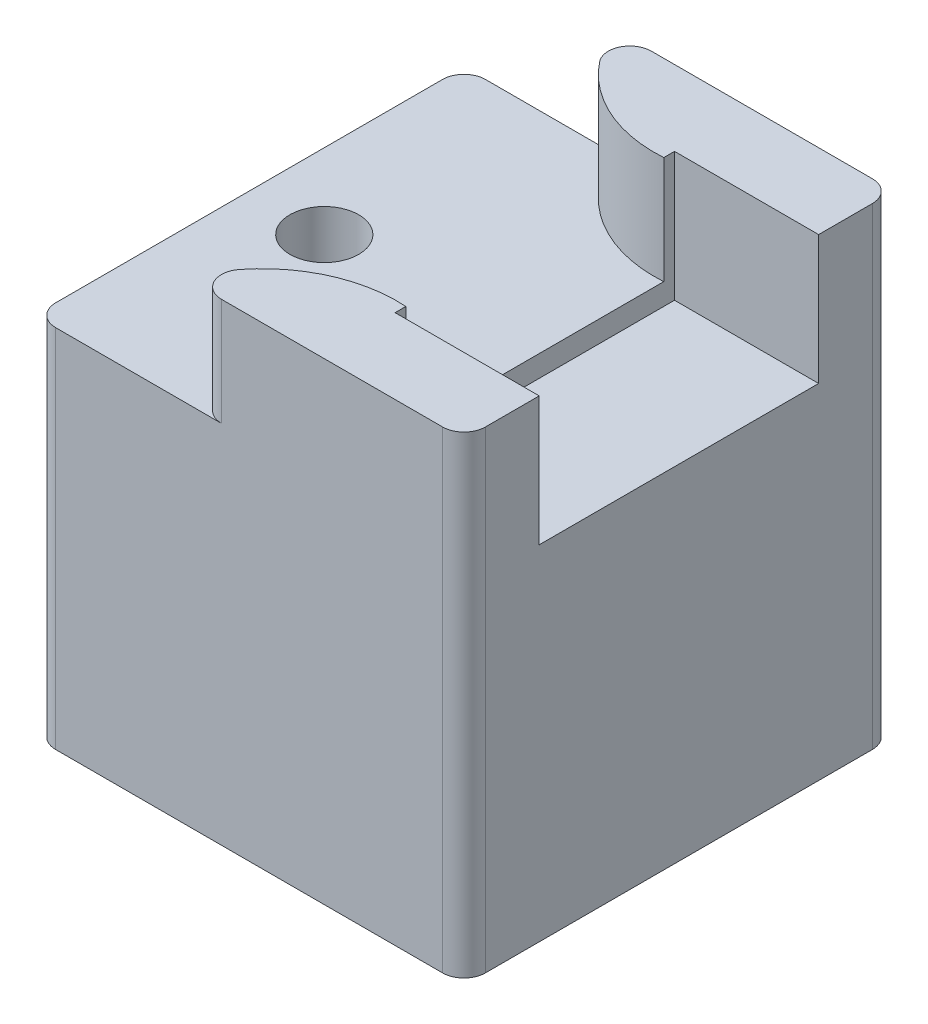
ISO-10303-21;
HEADER;
FILE_DESCRIPTION(('STEP AP214'),'2;1');
FILE_NAME('part.step','',(''),(''),'','','');
FILE_SCHEMA(('AUTOMOTIVE_DESIGN { 1 0 10303 214 1 1 1 1 }'));
ENDSEC;
DATA;
#1=APPLICATION_CONTEXT('core data for automotive mechanical design processes');
#2=APPLICATION_PROTOCOL_DEFINITION('international standard','automotive_design',2000,#1);
#3=PRODUCT_CONTEXT('',#1,'mechanical');
#4=PRODUCT('Part','Part','',(#3));
#5=PRODUCT_RELATED_PRODUCT_CATEGORY('part','',(#4));
#6=PRODUCT_DEFINITION_FORMATION('','',#4);
#7=PRODUCT_DEFINITION_CONTEXT('part definition',#1,'design');
#8=PRODUCT_DEFINITION('design','',#6,#7);
#9=PRODUCT_DEFINITION_SHAPE('','',#8);
#10=(LENGTH_UNIT() NAMED_UNIT(*) SI_UNIT(.MILLI.,.METRE.));
#11=(NAMED_UNIT(*) PLANE_ANGLE_UNIT() SI_UNIT($,.RADIAN.));
#12=(NAMED_UNIT(*) SI_UNIT($,.STERADIAN.) SOLID_ANGLE_UNIT());
#13=UNCERTAINTY_MEASURE_WITH_UNIT(LENGTH_MEASURE(1.E-05),#10,'distance_accuracy_value','');
#14=(GEOMETRIC_REPRESENTATION_CONTEXT(3) GLOBAL_UNCERTAINTY_ASSIGNED_CONTEXT((#13)) GLOBAL_UNIT_ASSIGNED_CONTEXT((#10,
#11,#12)) REPRESENTATION_CONTEXT('',''));
#15=CARTESIAN_POINT('',(0.,0.,0.));
#16=DIRECTION('',(0.,0.,1.));
#17=DIRECTION('',(1.,0.,0.));
#18=AXIS2_PLACEMENT_3D('',#15,#16,#17);
#19=CARTESIAN_POINT('',(-10.8433734939759,8.,-8.47389558232932));
#20=DIRECTION('',(1.,0.,0.));
#21=DIRECTION('',(0.,0.,-1.));
#22=AXIS2_PLACEMENT_3D('',#19,#20,#21);
#23=PLANE('',#22);
#24=DIRECTION('',(0.,0.,1.));
#25=VECTOR('',#24,1.);
#26=CARTESIAN_POINT('',(-10.8433734939759,3.,0.));
#27=LINE('',#26,#25);
#28=CARTESIAN_POINT('',(-10.8433734939759,3.,-7.47389558232932));
#29=VERTEX_POINT('',#28);
#30=CARTESIAN_POINT('',(-10.8433734939759,3.,10.5261044176707));
#31=VERTEX_POINT('',#30);
#32=EDGE_CURVE('E216',#29,#31,#27,.T.);
#33=ORIENTED_EDGE('',*,*,#32,.F.);
#34=DIRECTION('',(0.,-1.,0.));
#35=VECTOR('',#34,1.);
#36=CARTESIAN_POINT('',(-10.8433734939759,8.,-7.47389558232932));
#37=LINE('',#36,#35);
#38=CARTESIAN_POINT('',(-10.8433734939759,-14.,-7.47389558232932));
#39=VERTEX_POINT('',#38);
#40=EDGE_CURVE('E298',#29,#39,#37,.T.);
#41=ORIENTED_EDGE('',*,*,#40,.T.);
#42=DIRECTION('',(0.,0.,-1.));
#43=VECTOR('',#42,1.);
#44=CARTESIAN_POINT('',(-10.8433734939759,-14.,10.5261044176707));
#45=LINE('',#44,#43);
#46=CARTESIAN_POINT('',(-10.8433734939759,-14.,10.5261044176707));
#47=VERTEX_POINT('',#46);
#48=EDGE_CURVE('E181',#47,#39,#45,.T.);
#49=ORIENTED_EDGE('',*,*,#48,.F.);
#50=DIRECTION('',(0.,-1.,0.));
#51=VECTOR('',#50,1.);
#52=CARTESIAN_POINT('',(-10.8433734939759,8.,10.5261044176707));
#53=LINE('',#52,#51);
#54=EDGE_CURVE('E48',#47,#31,#53,.F.);
#55=ORIENTED_EDGE('',*,*,#54,.T.);
#56=EDGE_LOOP('',(#33,#41,#49,#55));
#57=FACE_BOUND('',#56,.T.);
#58=ADVANCED_FACE('F33',(#57),#23,.F.);
#59=CARTESIAN_POINT('',(-10.8433734939759,8.,11.5261044176707));
#60=DIRECTION('',(0.,0.,-1.));
#61=DIRECTION('',(-1.,0.,0.));
#62=AXIS2_PLACEMENT_3D('',#59,#60,#61);
#63=PLANE('',#62);
#64=DIRECTION('',(1.,0.,0.));
#65=VECTOR('',#64,1.);
#66=CARTESIAN_POINT('',(-10.8433734939759,8.,11.5261044176707));
#67=LINE('',#66,#65);
#68=CARTESIAN_POINT('',(-2.1258573550839,8.,11.5261044176707));
#69=VERTEX_POINT('',#68);
#70=CARTESIAN_POINT('',(8.1566265060241,8.,11.5261044176707));
#71=VERTEX_POINT('',#70);
#72=EDGE_CURVE('E255',#69,#71,#67,.T.);
#73=ORIENTED_EDGE('',*,*,#72,.F.);
#74=DIRECTION('',(0.,-1.,0.));
#75=VECTOR('',#74,1.);
#76=CARTESIAN_POINT('',(-2.1258573550839,3.,11.5261044176707));
#77=LINE('',#76,#75);
#78=CARTESIAN_POINT('',(-2.1258573550839,3.,11.5261044176707));
#79=VERTEX_POINT('',#78);
#80=EDGE_CURVE('E290',#69,#79,#77,.T.);
#81=ORIENTED_EDGE('',*,*,#80,.T.);
#82=DIRECTION('',(1.,0.,0.));
#83=VECTOR('',#82,1.);
#84=CARTESIAN_POINT('',(0.,3.,11.5261044176707));
#85=LINE('',#84,#83);
#86=CARTESIAN_POINT('',(-9.84337349397591,3.,11.5261044176707));
#87=VERTEX_POINT('',#86);
#88=EDGE_CURVE('E218',#87,#79,#85,.T.);
#89=ORIENTED_EDGE('',*,*,#88,.F.);
#90=DIRECTION('',(0.,-1.,0.));
#91=VECTOR('',#90,1.);
#92=CARTESIAN_POINT('',(-9.84337349397591,8.,11.5261044176707));
#93=LINE('',#92,#91);
#94=CARTESIAN_POINT('',(-9.84337349397591,-14.,11.5261044176707));
#95=VERTEX_POINT('',#94);
#96=EDGE_CURVE('E288',#87,#95,#93,.T.);
#97=ORIENTED_EDGE('',*,*,#96,.T.);
#98=DIRECTION('',(-1.,0.,0.));
#99=VECTOR('',#98,1.);
#100=CARTESIAN_POINT('',(8.1566265060241,-14.,11.5261044176707));
#101=LINE('',#100,#99);
#102=CARTESIAN_POINT('',(8.1566265060241,-14.,11.5261044176707));
#103=VERTEX_POINT('',#102);
#104=EDGE_CURVE('E194',#103,#95,#101,.T.);
#105=ORIENTED_EDGE('',*,*,#104,.F.);
#106=DIRECTION('',(0.,-1.,0.));
#107=VECTOR('',#106,1.);
#108=CARTESIAN_POINT('',(8.1566265060241,8.,11.5261044176707));
#109=LINE('',#108,#107);
#110=EDGE_CURVE('E286',#103,#71,#109,.F.);
#111=ORIENTED_EDGE('',*,*,#110,.T.);
#112=EDGE_LOOP('',(#73,#81,#89,#97,#105,#111));
#113=FACE_BOUND('',#112,.T.);
#114=ADVANCED_FACE('F330',(#113),#63,.F.);
#115=CARTESIAN_POINT('',(0.,8.,0.));
#116=DIRECTION('',(0.,1.,0.));
#117=DIRECTION('',(0.,0.,1.));
#118=AXIS2_PLACEMENT_3D('',#115,#116,#117);
#119=PLANE('',#118);
#120=CARTESIAN_POINT('',(2.02042580318857,8.,13.7850908464605));
#121=DIRECTION('',(0.,1.,0.));
#122=DIRECTION('',(0.,0.,1.));
#123=AXIS2_PLACEMENT_3D('',#120,#121,#122);
#124=CIRCLE('',#123,6.27377062182365);
#125=CARTESIAN_POINT('',(2.45087521889543,8.,7.52610441767068));
#126=VERTEX_POINT('',#125);
#127=CARTESIAN_POINT('',(-2.91206583011968,8.,9.90814306468661));
#128=VERTEX_POINT('',#127);
#129=EDGE_CURVE('E203',#126,#128,#124,.T.);
#130=ORIENTED_EDGE('',*,*,#129,.T.);
#131=CARTESIAN_POINT('',(-2.1258573550839,8.,10.5261044176707));
#132=DIRECTION('',(0.,1.,0.));
#133=DIRECTION('',(0.,0.,1.));
#134=AXIS2_PLACEMENT_3D('',#131,#132,#133);
#135=CIRCLE('',#134,1.);
#136=EDGE_CURVE('E284',#128,#69,#135,.T.);
#137=ORIENTED_EDGE('',*,*,#136,.T.);
#138=ORIENTED_EDGE('',*,*,#72,.T.);
#139=CARTESIAN_POINT('',(8.15662650602409,8.,10.5261044176707));
#140=DIRECTION('',(0.,1.,0.));
#141=DIRECTION('',(0.,0.,1.));
#142=AXIS2_PLACEMENT_3D('',#139,#140,#141);
#143=CIRCLE('',#142,1.);
#144=CARTESIAN_POINT('',(9.15662650602409,8.,10.5261044176707));
#145=VERTEX_POINT('',#144);
#146=EDGE_CURVE('E282',#71,#145,#143,.T.);
#147=ORIENTED_EDGE('',*,*,#146,.T.);
#148=DIRECTION('',(0.,0.,-1.));
#149=VECTOR('',#148,1.);
#150=CARTESIAN_POINT('',(9.15662650602409,8.,-8.47389558232932));
#151=LINE('',#150,#149);
#152=CARTESIAN_POINT('',(9.15662650602409,8.,8.02610441767068));
#153=VERTEX_POINT('',#152);
#154=EDGE_CURVE('E265',#145,#153,#151,.T.);
#155=ORIENTED_EDGE('',*,*,#154,.T.);
#156=DIRECTION('',(1.,0.,0.));
#157=VECTOR('',#156,1.);
#158=CARTESIAN_POINT('',(9.15662650602409,8.,8.02610441767068));
#159=LINE('',#158,#157);
#160=CARTESIAN_POINT('',(2.45087521889543,8.,8.02610441767068));
#161=VERTEX_POINT('',#160);
#162=EDGE_CURVE('E234',#161,#153,#159,.T.);
#163=ORIENTED_EDGE('',*,*,#162,.F.);
#164=DIRECTION('',(0.,0.,1.));
#165=VECTOR('',#164,1.);
#166=CARTESIAN_POINT('',(2.45087521889543,8.,-4.97389558232932));
#167=LINE('',#166,#165);
#168=EDGE_CURVE('E246',#126,#161,#167,.T.);
#169=ORIENTED_EDGE('',*,*,#168,.F.);
#170=EDGE_LOOP('',(#130,#137,#138,#147,#155,#163,#169));
#171=FACE_BOUND('',#170,.T.);
#172=ADVANCED_FACE('F346',(#171),#119,.T.);
#173=CARTESIAN_POINT('',(2.45087521889543,2.,-4.97389558232932));
#174=DIRECTION('',(-1.,0.,0.));
#175=DIRECTION('',(0.,0.,1.));
#176=AXIS2_PLACEMENT_3D('',#173,#174,#175);
#177=PLANE('',#176);
#178=DIRECTION('',(0.,1.,0.));
#179=VECTOR('',#178,1.);
#180=CARTESIAN_POINT('',(2.45087521889543,3.,7.52610441767068));
#181=LINE('',#180,#179);
#182=CARTESIAN_POINT('',(2.45087521889543,3.,7.52610441767068));
#183=VERTEX_POINT('',#182);
#184=EDGE_CURVE('E220',#183,#126,#181,.T.);
#185=ORIENTED_EDGE('',*,*,#184,.T.);
#186=ORIENTED_EDGE('',*,*,#168,.T.);
#187=DIRECTION('',(0.,1.,0.));
#188=VECTOR('',#187,1.);
#189=CARTESIAN_POINT('',(2.45087521889543,2.,8.02610441767068));
#190=LINE('',#189,#188);
#191=CARTESIAN_POINT('',(2.45087521889543,2.,8.02610441767068));
#192=VERTEX_POINT('',#191);
#193=EDGE_CURVE('E256',#192,#161,#190,.T.);
#194=ORIENTED_EDGE('',*,*,#193,.F.);
#195=DIRECTION('',(0.,0.,1.));
#196=VECTOR('',#195,1.);
#197=CARTESIAN_POINT('',(2.45087521889543,2.,-4.97389558232932));
#198=LINE('',#197,#196);
#199=CARTESIAN_POINT('',(2.45087521889543,2.,-4.97389558232932));
#200=VERTEX_POINT('',#199);
#201=EDGE_CURVE('E237',#200,#192,#198,.T.);
#202=ORIENTED_EDGE('',*,*,#201,.F.);
#203=DIRECTION('',(0.,1.,0.));
#204=VECTOR('',#203,1.);
#205=CARTESIAN_POINT('',(2.45087521889543,2.,-4.97389558232932));
#206=LINE('',#205,#204);
#207=CARTESIAN_POINT('',(2.45087521889543,8.,-4.97389558232932));
#208=VERTEX_POINT('',#207);
#209=EDGE_CURVE('E259',#200,#208,#206,.T.);
#210=ORIENTED_EDGE('',*,*,#209,.T.);
#211=CARTESIAN_POINT('',(2.45087521889543,8.,-4.47389558232932));
#212=VERTEX_POINT('',#211);
#213=EDGE_CURVE('E247',#208,#212,#167,.T.);
#214=ORIENTED_EDGE('',*,*,#213,.T.);
#215=DIRECTION('',(0.,1.,0.));
#216=VECTOR('',#215,1.);
#217=CARTESIAN_POINT('',(2.45087521889543,3.,-4.47389558232932));
#218=LINE('',#217,#216);
#219=CARTESIAN_POINT('',(2.45087521889543,3.,-4.47389558232932));
#220=VERTEX_POINT('',#219);
#221=EDGE_CURVE('E225',#220,#212,#218,.T.);
#222=ORIENTED_EDGE('',*,*,#221,.F.);
#223=DIRECTION('',(0.,0.,-1.));
#224=VECTOR('',#223,1.);
#225=CARTESIAN_POINT('',(2.45087521889543,3.,0.));
#226=LINE('',#225,#224);
#227=EDGE_CURVE('E207',#183,#220,#226,.T.);
#228=ORIENTED_EDGE('',*,*,#227,.F.);
#229=EDGE_LOOP('',(#185,#186,#194,#202,#210,#214,#222,#228));
#230=FACE_BOUND('',#229,.T.);
#231=ADVANCED_FACE('F349',(#230),#177,.F.);
#232=CARTESIAN_POINT('',(9.15662650602409,8.,-8.47389558232932));
#233=DIRECTION('',(-1.,0.,0.));
#234=DIRECTION('',(0.,0.,1.));
#235=AXIS2_PLACEMENT_3D('',#232,#233,#234);
#236=PLANE('',#235);
#237=DIRECTION('',(0.,-1.,0.));
#238=VECTOR('',#237,1.);
#239=CARTESIAN_POINT('',(9.15662650602409,8.,10.5261044176707));
#240=LINE('',#239,#238);
#241=CARTESIAN_POINT('',(9.15662650602409,-14.,10.5261044176707));
#242=VERTEX_POINT('',#241);
#243=EDGE_CURVE('E293',#145,#242,#240,.T.);
#244=ORIENTED_EDGE('',*,*,#243,.T.);
#245=DIRECTION('',(0.,0.,1.));
#246=VECTOR('',#245,1.);
#247=CARTESIAN_POINT('',(9.15662650602409,-14.,-7.47389558232932));
#248=LINE('',#247,#246);
#249=CARTESIAN_POINT('',(9.15662650602409,-14.,-7.47389558232932));
#250=VERTEX_POINT('',#249);
#251=EDGE_CURVE('E188',#250,#242,#248,.T.);
#252=ORIENTED_EDGE('',*,*,#251,.F.);
#253=DIRECTION('',(0.,-1.,0.));
#254=VECTOR('',#253,1.);
#255=CARTESIAN_POINT('',(9.15662650602409,8.,-7.47389558232932));
#256=LINE('',#255,#254);
#257=CARTESIAN_POINT('',(9.15662650602409,8.,-7.47389558232932));
#258=VERTEX_POINT('',#257);
#259=EDGE_CURVE('E295',#250,#258,#256,.F.);
#260=ORIENTED_EDGE('',*,*,#259,.T.);
#261=CARTESIAN_POINT('',(9.15662650602409,8.,-4.97389558232932));
#262=VERTEX_POINT('',#261);
#263=EDGE_CURVE('E264',#262,#258,#151,.T.);
#264=ORIENTED_EDGE('',*,*,#263,.F.);
#265=DIRECTION('',(0.,1.,0.));
#266=VECTOR('',#265,1.);
#267=CARTESIAN_POINT('',(9.15662650602409,2.,-4.97389558232932));
#268=LINE('',#267,#266);
#269=CARTESIAN_POINT('',(9.15662650602409,2.,-4.97389558232932));
#270=VERTEX_POINT('',#269);
#271=EDGE_CURVE('E243',#270,#262,#268,.T.);
#272=ORIENTED_EDGE('',*,*,#271,.F.);
#273=DIRECTION('',(0.,0.,-1.));
#274=VECTOR('',#273,1.);
#275=CARTESIAN_POINT('',(9.15662650602409,2.,-4.97389558232932));
#276=LINE('',#275,#274);
#277=CARTESIAN_POINT('',(9.15662650602409,2.,8.02610441767068));
#278=VERTEX_POINT('',#277);
#279=EDGE_CURVE('E230',#278,#270,#276,.T.);
#280=ORIENTED_EDGE('',*,*,#279,.F.);
#281=DIRECTION('',(0.,1.,0.));
#282=VECTOR('',#281,1.);
#283=CARTESIAN_POINT('',(9.15662650602409,2.,8.02610441767068));
#284=LINE('',#283,#282);
#285=EDGE_CURVE('E252',#278,#153,#284,.T.);
#286=ORIENTED_EDGE('',*,*,#285,.T.);
#287=ORIENTED_EDGE('',*,*,#154,.F.);
#288=EDGE_LOOP('',(#244,#252,#260,#264,#272,#280,#286,#287));
#289=FACE_BOUND('',#288,.T.);
#290=ADVANCED_FACE('F321',(#289),#236,.F.);
#291=CARTESIAN_POINT('',(-10.8433734939759,8.,-8.47389558232932));
#292=DIRECTION('',(0.,0.,1.));
#293=DIRECTION('',(1.,0.,0.));
#294=AXIS2_PLACEMENT_3D('',#291,#292,#293);
#295=PLANE('',#294);
#296=DIRECTION('',(-1.,0.,0.));
#297=VECTOR('',#296,1.);
#298=CARTESIAN_POINT('',(0.,3.,-8.47389558232932));
#299=LINE('',#298,#297);
#300=CARTESIAN_POINT('',(-2.12585735508389,3.,-8.47389558232932));
#301=VERTEX_POINT('',#300);
#302=CARTESIAN_POINT('',(-9.84337349397591,3.,-8.47389558232932));
#303=VERTEX_POINT('',#302);
#304=EDGE_CURVE('E214',#301,#303,#299,.T.);
#305=ORIENTED_EDGE('',*,*,#304,.F.);
#306=DIRECTION('',(0.,1.,0.));
#307=VECTOR('',#306,1.);
#308=CARTESIAN_POINT('',(-2.12585735508389,8.,-8.47389558232932));
#309=LINE('',#308,#307);
#310=CARTESIAN_POINT('',(-2.12585735508389,8.,-8.47389558232932));
#311=VERTEX_POINT('',#310);
#312=EDGE_CURVE('E270',#301,#311,#309,.T.);
#313=ORIENTED_EDGE('',*,*,#312,.T.);
#314=DIRECTION('',(-1.,0.,0.));
#315=VECTOR('',#314,1.);
#316=CARTESIAN_POINT('',(-10.8433734939759,8.,-8.47389558232932));
#317=LINE('',#316,#315);
#318=CARTESIAN_POINT('',(8.15662650602409,8.,-8.47389558232932));
#319=VERTEX_POINT('',#318);
#320=EDGE_CURVE('E165',#319,#311,#317,.T.);
#321=ORIENTED_EDGE('',*,*,#320,.F.);
#322=DIRECTION('',(0.,-1.,0.));
#323=VECTOR('',#322,1.);
#324=CARTESIAN_POINT('',(8.15662650602409,8.,-8.47389558232932));
#325=LINE('',#324,#323);
#326=CARTESIAN_POINT('',(8.15662650602409,-14.,-8.47389558232932));
#327=VERTEX_POINT('',#326);
#328=EDGE_CURVE('E164',#319,#327,#325,.T.);
#329=ORIENTED_EDGE('',*,*,#328,.T.);
#330=DIRECTION('',(1.,0.,0.));
#331=VECTOR('',#330,1.);
#332=CARTESIAN_POINT('',(-9.84337349397591,-14.,-8.47389558232932));
#333=LINE('',#332,#331);
#334=CARTESIAN_POINT('',(-9.84337349397591,-14.,-8.47389558232932));
#335=VERTEX_POINT('',#334);
#336=EDGE_CURVE('E168',#335,#327,#333,.T.);
#337=ORIENTED_EDGE('',*,*,#336,.F.);
#338=DIRECTION('',(0.,-1.,0.));
#339=VECTOR('',#338,1.);
#340=CARTESIAN_POINT('',(-9.84337349397591,8.,-8.47389558232932));
#341=LINE('',#340,#339);
#342=EDGE_CURVE('E157',#335,#303,#341,.F.);
#343=ORIENTED_EDGE('',*,*,#342,.T.);
#344=EDGE_LOOP('',(#305,#313,#321,#329,#337,#343));
#345=FACE_BOUND('',#344,.T.);
#346=ADVANCED_FACE('F169',(#345),#295,.F.);
#347=ORIENTED_EDGE('',*,*,#320,.T.);
#348=CARTESIAN_POINT('',(-2.12585735508389,8.,-7.47389558232932));
#349=DIRECTION('',(0.,1.,0.));
#350=DIRECTION('',(0.,0.,1.));
#351=AXIS2_PLACEMENT_3D('',#348,#349,#350);
#352=CIRCLE('',#351,1.);
#353=CARTESIAN_POINT('',(-2.91206583011967,8.,-6.85593422934524));
#354=VERTEX_POINT('',#353);
#355=EDGE_CURVE('E275',#311,#354,#352,.T.);
#356=ORIENTED_EDGE('',*,*,#355,.T.);
#357=CARTESIAN_POINT('',(2.02042580318859,8.,-10.7328820111191));
#358=DIRECTION('',(0.,1.,0.));
#359=DIRECTION('',(0.,0.,1.));
#360=AXIS2_PLACEMENT_3D('',#357,#358,#359);
#361=CIRCLE('',#360,6.27377062182364);
#362=EDGE_CURVE('E208',#212,#354,#361,.F.);
#363=ORIENTED_EDGE('',*,*,#362,.F.);
#364=ORIENTED_EDGE('',*,*,#213,.F.);
#365=DIRECTION('',(-1.,0.,0.));
#366=VECTOR('',#365,1.);
#367=CARTESIAN_POINT('',(9.15662650602409,8.,-4.97389558232932));
#368=LINE('',#367,#366);
#369=EDGE_CURVE('E227',#262,#208,#368,.T.);
#370=ORIENTED_EDGE('',*,*,#369,.F.);
#371=ORIENTED_EDGE('',*,*,#263,.T.);
#372=CARTESIAN_POINT('',(8.15662650602409,8.,-7.47389558232932));
#373=DIRECTION('',(0.,1.,0.));
#374=DIRECTION('',(0.,0.,1.));
#375=AXIS2_PLACEMENT_3D('',#372,#373,#374);
#376=CIRCLE('',#375,1.);
#377=EDGE_CURVE('E273',#258,#319,#376,.T.);
#378=ORIENTED_EDGE('',*,*,#377,.T.);
#379=EDGE_LOOP('',(#347,#356,#363,#364,#370,#371,#378));
#380=FACE_BOUND('',#379,.T.);
#381=ADVANCED_FACE('F310',(#380),#119,.T.);
#382=CARTESIAN_POINT('',(9.15662650602409,2.,8.02610441767068));
#383=DIRECTION('',(0.,0.,1.));
#384=DIRECTION('',(1.,0.,0.));
#385=AXIS2_PLACEMENT_3D('',#382,#383,#384);
#386=PLANE('',#385);
#387=ORIENTED_EDGE('',*,*,#162,.T.);
#388=ORIENTED_EDGE('',*,*,#285,.F.);
#389=DIRECTION('',(1.,0.,0.));
#390=VECTOR('',#389,1.);
#391=CARTESIAN_POINT('',(9.15662650602409,2.,8.02610441767068));
#392=LINE('',#391,#390);
#393=EDGE_CURVE('E240',#192,#278,#392,.T.);
#394=ORIENTED_EDGE('',*,*,#393,.F.);
#395=ORIENTED_EDGE('',*,*,#193,.T.);
#396=EDGE_LOOP('',(#387,#388,#394,#395));
#397=FACE_BOUND('',#396,.T.);
#398=ADVANCED_FACE('F354',(#397),#386,.F.);
#399=CARTESIAN_POINT('',(9.15662650602409,2.,-4.97389558232932));
#400=DIRECTION('',(0.,0.,-1.));
#401=DIRECTION('',(-1.,0.,0.));
#402=AXIS2_PLACEMENT_3D('',#399,#400,#401);
#403=PLANE('',#402);
#404=ORIENTED_EDGE('',*,*,#369,.T.);
#405=ORIENTED_EDGE('',*,*,#209,.F.);
#406=DIRECTION('',(-1.,0.,0.));
#407=VECTOR('',#406,1.);
#408=CARTESIAN_POINT('',(9.15662650602409,2.,-4.97389558232932));
#409=LINE('',#408,#407);
#410=EDGE_CURVE('E233',#270,#200,#409,.T.);
#411=ORIENTED_EDGE('',*,*,#410,.F.);
#412=ORIENTED_EDGE('',*,*,#271,.T.);
#413=EDGE_LOOP('',(#404,#405,#411,#412));
#414=FACE_BOUND('',#413,.T.);
#415=ADVANCED_FACE('F360',(#414),#403,.F.);
#416=CARTESIAN_POINT('',(0.,2.,0.));
#417=DIRECTION('',(0.,-1.,0.));
#418=DIRECTION('',(0.,0.,-1.));
#419=AXIS2_PLACEMENT_3D('',#416,#417,#418);
#420=PLANE('',#419);
#421=ORIENTED_EDGE('',*,*,#279,.T.);
#422=ORIENTED_EDGE('',*,*,#410,.T.);
#423=ORIENTED_EDGE('',*,*,#201,.T.);
#424=ORIENTED_EDGE('',*,*,#393,.T.);
#425=EDGE_LOOP('',(#421,#422,#423,#424));
#426=FACE_BOUND('',#425,.T.);
#427=ADVANCED_FACE('F357',(#426),#420,.F.);
#428=CARTESIAN_POINT('',(2.02042580318857,3.,13.7850908464605));
#429=DIRECTION('',(0.,1.,0.));
#430=DIRECTION('',(0.,0.,1.));
#431=AXIS2_PLACEMENT_3D('',#428,#429,#430);
#432=CYLINDRICAL_SURFACE('',#431,6.27377062182365);
#433=CARTESIAN_POINT('',(2.02042580318857,3.,13.7850908464605));
#434=DIRECTION('',(0.,1.,0.));
#435=DIRECTION('',(0.,0.,1.));
#436=AXIS2_PLACEMENT_3D('',#433,#434,#435);
#437=CIRCLE('',#436,6.27377062182365);
#438=CARTESIAN_POINT('',(-2.91206583011968,3.,9.90814306468661));
#439=VERTEX_POINT('',#438);
#440=EDGE_CURVE('E204',#183,#439,#437,.T.);
#441=ORIENTED_EDGE('',*,*,#440,.T.);
#442=DIRECTION('',(0.,1.,0.));
#443=VECTOR('',#442,1.);
#444=CARTESIAN_POINT('',(-2.91206583011968,3.,9.90814306468661));
#445=LINE('',#444,#443);
#446=EDGE_CURVE('E279',#439,#128,#445,.T.);
#447=ORIENTED_EDGE('',*,*,#446,.T.);
#448=ORIENTED_EDGE('',*,*,#129,.F.);
#449=ORIENTED_EDGE('',*,*,#184,.F.);
#450=EDGE_LOOP('',(#441,#447,#448,#449));
#451=FACE_BOUND('',#450,.T.);
#452=ADVANCED_FACE('F342',(#451),#432,.T.);
#453=CARTESIAN_POINT('',(2.02042580318859,3.,-10.7328820111191));
#454=DIRECTION('',(0.,1.,0.));
#455=DIRECTION('',(0.,0.,1.));
#456=AXIS2_PLACEMENT_3D('',#453,#454,#455);
#457=CYLINDRICAL_SURFACE('',#456,6.27377062182364);
#458=ORIENTED_EDGE('',*,*,#362,.T.);
#459=DIRECTION('',(0.,1.,0.));
#460=VECTOR('',#459,1.);
#461=CARTESIAN_POINT('',(-2.91206583011967,3.,-6.85593422934524));
#462=LINE('',#461,#460);
#463=CARTESIAN_POINT('',(-2.91206583011967,3.,-6.85593422934524));
#464=VERTEX_POINT('',#463);
#465=EDGE_CURVE('E277',#354,#464,#462,.F.);
#466=ORIENTED_EDGE('',*,*,#465,.T.);
#467=CARTESIAN_POINT('',(2.02042580318859,3.,-10.7328820111191));
#468=DIRECTION('',(0.,1.,0.));
#469=DIRECTION('',(0.,0.,1.));
#470=AXIS2_PLACEMENT_3D('',#467,#468,#469);
#471=CIRCLE('',#470,6.27377062182364);
#472=EDGE_CURVE('E211',#220,#464,#471,.F.);
#473=ORIENTED_EDGE('',*,*,#472,.F.);
#474=ORIENTED_EDGE('',*,*,#221,.T.);
#475=EDGE_LOOP('',(#458,#466,#473,#474));
#476=FACE_BOUND('',#475,.T.);
#477=ADVANCED_FACE('F364',(#476),#457,.T.);
#478=CARTESIAN_POINT('',(0.,3.,0.));
#479=DIRECTION('',(0.,1.,0.));
#480=DIRECTION('',(0.,0.,1.));
#481=AXIS2_PLACEMENT_3D('',#478,#479,#480);
#482=PLANE('',#481);
#483=CARTESIAN_POINT('',(-7.34337349397591,3.,1.52610441767068));
#484=DIRECTION('',(0.,1.,0.));
#485=DIRECTION('',(0.,0.,1.));
#486=AXIS2_PLACEMENT_3D('',#483,#484,#485);
#487=CIRCLE('',#486,1.6);
#488=CARTESIAN_POINT('',(-7.34337349397591,3.,3.12610441767068));
#489=VERTEX_POINT('',#488);
#490=EDGE_CURVE('E200',#489,#489,#487,.T.);
#491=ORIENTED_EDGE('',*,*,#490,.F.);
#492=EDGE_LOOP('',(#491));
#493=FACE_BOUND('',#492,.T.);
#494=ORIENTED_EDGE('',*,*,#304,.T.);
#495=CARTESIAN_POINT('',(-9.84337349397591,3.,-7.47389558232932));
#496=DIRECTION('',(0.,1.,0.));
#497=DIRECTION('',(0.,0.,1.));
#498=AXIS2_PLACEMENT_3D('',#495,#496,#497);
#499=CIRCLE('',#498,1.);
#500=EDGE_CURVE('E55',#303,#29,#499,.T.);
#501=ORIENTED_EDGE('',*,*,#500,.T.);
#502=ORIENTED_EDGE('',*,*,#32,.T.);
#503=CARTESIAN_POINT('',(-9.84337349397591,3.,10.5261044176707));
#504=DIRECTION('',(0.,1.,0.));
#505=DIRECTION('',(0.,0.,1.));
#506=AXIS2_PLACEMENT_3D('',#503,#504,#505);
#507=CIRCLE('',#506,1.);
#508=EDGE_CURVE('E300',#31,#87,#507,.T.);
#509=ORIENTED_EDGE('',*,*,#508,.T.);
#510=ORIENTED_EDGE('',*,*,#88,.T.);
#511=CARTESIAN_POINT('',(-2.1258573550839,3.,10.5261044176707));
#512=DIRECTION('',(0.,1.,0.));
#513=DIRECTION('',(0.,0.,1.));
#514=AXIS2_PLACEMENT_3D('',#511,#512,#513);
#515=CIRCLE('',#514,1.);
#516=EDGE_CURVE('E11',#79,#439,#515,.F.);
#517=ORIENTED_EDGE('',*,*,#516,.T.);
#518=ORIENTED_EDGE('',*,*,#440,.F.);
#519=ORIENTED_EDGE('',*,*,#227,.T.);
#520=ORIENTED_EDGE('',*,*,#472,.T.);
#521=CARTESIAN_POINT('',(-2.12585735508389,3.,-7.47389558232932));
#522=DIRECTION('',(0.,1.,0.));
#523=DIRECTION('',(0.,0.,1.));
#524=AXIS2_PLACEMENT_3D('',#521,#522,#523);
#525=CIRCLE('',#524,1.);
#526=EDGE_CURVE('E41',#464,#301,#525,.F.);
#527=ORIENTED_EDGE('',*,*,#526,.T.);
#528=EDGE_LOOP('',(#494,#501,#502,#509,#510,#517,#518,#519,#520,#527));
#529=FACE_BOUND('',#528,.T.);
#530=ADVANCED_FACE('F305',(#493,#529),#482,.T.);
#531=CARTESIAN_POINT('',(-7.34337349397591,0.,1.52610441767068));
#532=DIRECTION('',(0.,1.,0.));
#533=DIRECTION('',(0.,0.,1.));
#534=AXIS2_PLACEMENT_3D('',#531,#532,#533);
#535=CYLINDRICAL_SURFACE('',#534,1.6);
#536=ORIENTED_EDGE('',*,*,#490,.T.);
#537=EDGE_LOOP('',(#536));
#538=FACE_BOUND('',#537,.T.);
#539=CARTESIAN_POINT('',(-7.34337349397591,-14.,1.52610441767068));
#540=DIRECTION('',(0.,-1.,0.));
#541=DIRECTION('',(0.,0.,-1.));
#542=AXIS2_PLACEMENT_3D('',#539,#540,#541);
#543=CIRCLE('',#542,1.6);
#544=CARTESIAN_POINT('',(-7.34337349397591,-14.,-0.0738955823293187));
#545=VERTEX_POINT('',#544);
#546=EDGE_CURVE('E182',#545,#545,#543,.T.);
#547=ORIENTED_EDGE('',*,*,#546,.T.);
#548=EDGE_LOOP('',(#547));
#549=FACE_BOUND('',#548,.T.);
#550=ADVANCED_FACE('F371',(#538,#549),#535,.F.);
#551=CARTESIAN_POINT('',(-2.12585735508389,3.,-7.47389558232932));
#552=DIRECTION('',(0.,1.,0.));
#553=DIRECTION('',(0.,0.,1.));
#554=AXIS2_PLACEMENT_3D('',#551,#552,#553);
#555=CYLINDRICAL_SURFACE('',#554,1.);
#556=ORIENTED_EDGE('',*,*,#526,.F.);
#557=ORIENTED_EDGE('',*,*,#465,.F.);
#558=ORIENTED_EDGE('',*,*,#355,.F.);
#559=ORIENTED_EDGE('',*,*,#312,.F.);
#560=EDGE_LOOP('',(#556,#557,#558,#559));
#561=FACE_BOUND('',#560,.T.);
#562=ADVANCED_FACE('F308',(#561),#555,.T.);
#563=CARTESIAN_POINT('',(-2.1258573550839,3.,10.5261044176707));
#564=DIRECTION('',(0.,1.,0.));
#565=DIRECTION('',(0.,0.,1.));
#566=AXIS2_PLACEMENT_3D('',#563,#564,#565);
#567=CYLINDRICAL_SURFACE('',#566,1.);
#568=ORIENTED_EDGE('',*,*,#516,.F.);
#569=ORIENTED_EDGE('',*,*,#80,.F.);
#570=ORIENTED_EDGE('',*,*,#136,.F.);
#571=ORIENTED_EDGE('',*,*,#446,.F.);
#572=EDGE_LOOP('',(#568,#569,#570,#571));
#573=FACE_BOUND('',#572,.T.);
#574=ADVANCED_FACE('F340',(#573),#567,.T.);
#575=CARTESIAN_POINT('',(8.15662650602409,8.,-7.47389558232932));
#576=DIRECTION('',(0.,-1.,0.));
#577=DIRECTION('',(0.,0.,-1.));
#578=AXIS2_PLACEMENT_3D('',#575,#576,#577);
#579=CYLINDRICAL_SURFACE('',#578,1.);
#580=ORIENTED_EDGE('',*,*,#377,.F.);
#581=ORIENTED_EDGE('',*,*,#259,.F.);
#582=CARTESIAN_POINT('',(8.15662650602409,-14.,-7.47389558232932));
#583=DIRECTION('',(0.,-1.,0.));
#584=DIRECTION('',(0.,0.,-1.));
#585=AXIS2_PLACEMENT_3D('',#582,#583,#584);
#586=CIRCLE('',#585,1.);
#587=EDGE_CURVE('E175',#327,#250,#586,.T.);
#588=ORIENTED_EDGE('',*,*,#587,.F.);
#589=ORIENTED_EDGE('',*,*,#328,.F.);
#590=EDGE_LOOP('',(#580,#581,#588,#589));
#591=FACE_BOUND('',#590,.T.);
#592=ADVANCED_FACE('F317',(#591),#579,.T.);
#593=CARTESIAN_POINT('',(-9.84337349397591,8.,-7.47389558232932));
#594=DIRECTION('',(0.,-1.,0.));
#595=DIRECTION('',(0.,0.,-1.));
#596=AXIS2_PLACEMENT_3D('',#593,#594,#595);
#597=CYLINDRICAL_SURFACE('',#596,1.);
#598=ORIENTED_EDGE('',*,*,#500,.F.);
#599=ORIENTED_EDGE('',*,*,#342,.F.);
#600=CARTESIAN_POINT('',(-9.84337349397591,-14.,-7.47389558232932));
#601=DIRECTION('',(0.,-1.,0.));
#602=DIRECTION('',(0.,0.,-1.));
#603=AXIS2_PLACEMENT_3D('',#600,#601,#602);
#604=CIRCLE('',#603,1.);
#605=EDGE_CURVE('E162',#39,#335,#604,.T.);
#606=ORIENTED_EDGE('',*,*,#605,.F.);
#607=ORIENTED_EDGE('',*,*,#40,.F.);
#608=EDGE_LOOP('',(#598,#599,#606,#607));
#609=FACE_BOUND('',#608,.T.);
#610=ADVANCED_FACE('F159',(#609),#597,.T.);
#611=CARTESIAN_POINT('',(-9.84337349397591,8.,10.5261044176707));
#612=DIRECTION('',(0.,-1.,0.));
#613=DIRECTION('',(0.,0.,-1.));
#614=AXIS2_PLACEMENT_3D('',#611,#612,#613);
#615=CYLINDRICAL_SURFACE('',#614,1.);
#616=ORIENTED_EDGE('',*,*,#508,.F.);
#617=ORIENTED_EDGE('',*,*,#54,.F.);
#618=CARTESIAN_POINT('',(-9.84337349397591,-14.,10.5261044176707));
#619=DIRECTION('',(0.,-1.,0.));
#620=DIRECTION('',(0.,0.,-1.));
#621=AXIS2_PLACEMENT_3D('',#618,#619,#620);
#622=CIRCLE('',#621,1.);
#623=EDGE_CURVE('E197',#95,#47,#622,.T.);
#624=ORIENTED_EDGE('',*,*,#623,.F.);
#625=ORIENTED_EDGE('',*,*,#96,.F.);
#626=EDGE_LOOP('',(#616,#617,#624,#625));
#627=FACE_BOUND('',#626,.T.);
#628=ADVANCED_FACE('F335',(#627),#615,.T.);
#629=CARTESIAN_POINT('',(8.15662650602409,8.,10.5261044176707));
#630=DIRECTION('',(0.,-1.,0.));
#631=DIRECTION('',(0.,0.,-1.));
#632=AXIS2_PLACEMENT_3D('',#629,#630,#631);
#633=CYLINDRICAL_SURFACE('',#632,1.);
#634=ORIENTED_EDGE('',*,*,#146,.F.);
#635=ORIENTED_EDGE('',*,*,#110,.F.);
#636=CARTESIAN_POINT('',(8.15662650602409,-14.,10.5261044176707));
#637=DIRECTION('',(0.,-1.,0.));
#638=DIRECTION('',(0.,0.,-1.));
#639=AXIS2_PLACEMENT_3D('',#636,#637,#638);
#640=CIRCLE('',#639,1.);
#641=EDGE_CURVE('E191',#242,#103,#640,.T.);
#642=ORIENTED_EDGE('',*,*,#641,.F.);
#643=ORIENTED_EDGE('',*,*,#243,.F.);
#644=EDGE_LOOP('',(#634,#635,#642,#643));
#645=FACE_BOUND('',#644,.T.);
#646=ADVANCED_FACE('F35',(#645),#633,.T.);
#647=CARTESIAN_POINT('',(-9.84337349397591,-14.,-7.47389558232932));
#648=DIRECTION('',(0.,-1.,0.));
#649=DIRECTION('',(0.,0.,-1.));
#650=AXIS2_PLACEMENT_3D('',#647,#648,#649);
#651=PLANE('',#650);
#652=ORIENTED_EDGE('',*,*,#605,.T.);
#653=ORIENTED_EDGE('',*,*,#336,.T.);
#654=ORIENTED_EDGE('',*,*,#587,.T.);
#655=ORIENTED_EDGE('',*,*,#251,.T.);
#656=ORIENTED_EDGE('',*,*,#641,.T.);
#657=ORIENTED_EDGE('',*,*,#104,.T.);
#658=ORIENTED_EDGE('',*,*,#623,.T.);
#659=ORIENTED_EDGE('',*,*,#48,.T.);
#660=EDGE_LOOP('',(#652,#653,#654,#655,#656,#657,#658,#659));
#661=FACE_BOUND('',#660,.T.);
#662=ORIENTED_EDGE('',*,*,#546,.F.);
#663=EDGE_LOOP('',(#662));
#664=FACE_BOUND('',#663,.T.);
#665=ADVANCED_FACE('F178',(#661,#664),#651,.T.);
#666=CLOSED_SHELL('',(#58,#114,#172,#231,#290,#346,#381,#398,#415,#427,#452,#477,#530,#550,#562,
#574,#592,#610,#628,#646,#665));
#667=MANIFOLD_SOLID_BREP('B2',#666);
#668=ADVANCED_BREP_SHAPE_REPRESENTATION('',(#18,#667),#14);
#669=SHAPE_DEFINITION_REPRESENTATION(#9,#668);
ENDSEC;
END-ISO-10303-21;
